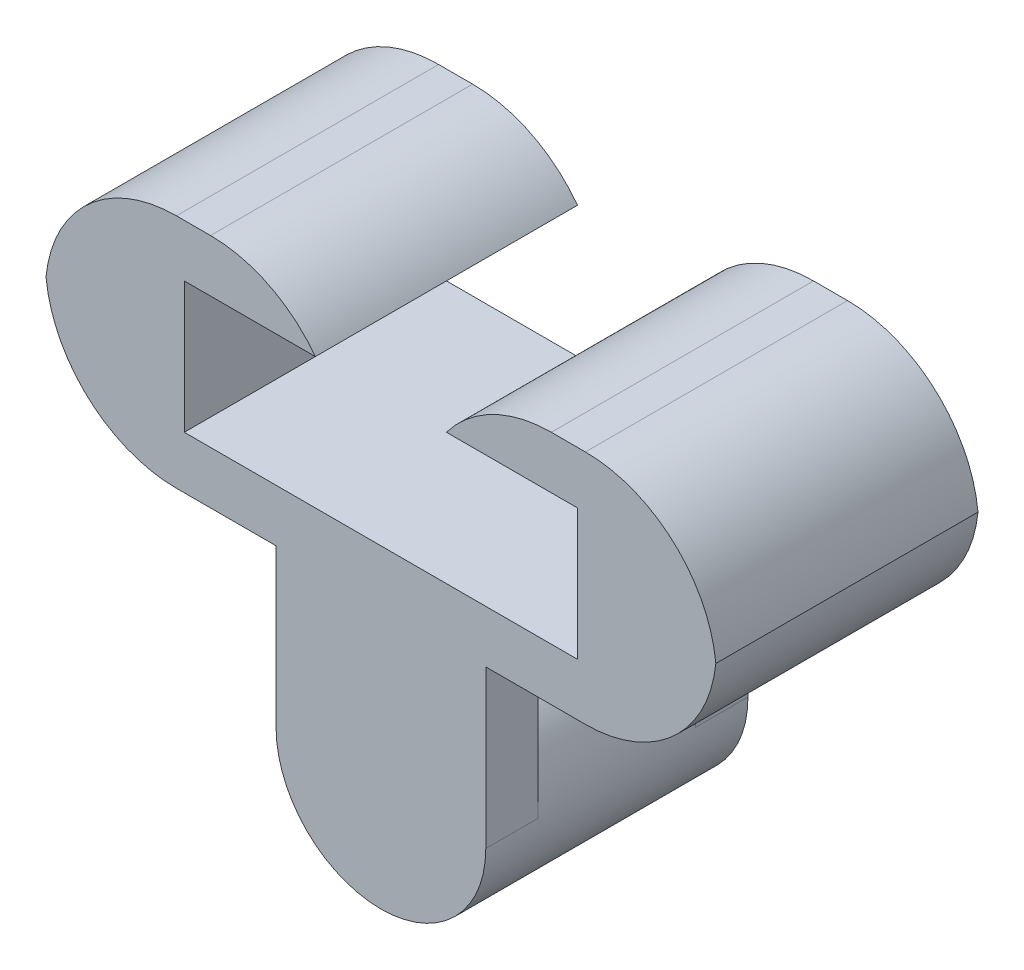
ISO-10303-21;
HEADER;
FILE_DESCRIPTION(('STEP AP214'),'2;1');
FILE_NAME('part.step','',(''),(''),'','','');
FILE_SCHEMA(('AUTOMOTIVE_DESIGN { 1 0 10303 214 1 1 1 1 }'));
ENDSEC;
DATA;
#1=APPLICATION_CONTEXT('core data for automotive mechanical design processes');
#2=APPLICATION_PROTOCOL_DEFINITION('international standard','automotive_design',2000,#1);
#3=PRODUCT_CONTEXT('',#1,'mechanical');
#4=PRODUCT('Part','Part','',(#3));
#5=PRODUCT_RELATED_PRODUCT_CATEGORY('part','',(#4));
#6=PRODUCT_DEFINITION_FORMATION('','',#4);
#7=PRODUCT_DEFINITION_CONTEXT('part definition',#1,'design');
#8=PRODUCT_DEFINITION('design','',#6,#7);
#9=PRODUCT_DEFINITION_SHAPE('','',#8);
#10=(LENGTH_UNIT() NAMED_UNIT(*) SI_UNIT(.MILLI.,.METRE.));
#11=(NAMED_UNIT(*) PLANE_ANGLE_UNIT() SI_UNIT($,.RADIAN.));
#12=(NAMED_UNIT(*) SI_UNIT($,.STERADIAN.) SOLID_ANGLE_UNIT());
#13=UNCERTAINTY_MEASURE_WITH_UNIT(LENGTH_MEASURE(1.E-05),#10,'distance_accuracy_value','');
#14=(GEOMETRIC_REPRESENTATION_CONTEXT(3) GLOBAL_UNCERTAINTY_ASSIGNED_CONTEXT((#13)) GLOBAL_UNIT_ASSIGNED_CONTEXT((#10,
#11,#12)) REPRESENTATION_CONTEXT('',''));
#15=CARTESIAN_POINT('',(0.,0.,0.));
#16=DIRECTION('',(0.,0.,1.));
#17=DIRECTION('',(1.,0.,0.));
#18=AXIS2_PLACEMENT_3D('',#15,#16,#17);
#19=CARTESIAN_POINT('',(65.024,-22.86,25.4));
#20=DIRECTION('',(0.,-1.,0.));
#21=DIRECTION('',(1.,0.,0.));
#22=AXIS2_PLACEMENT_3D('',#19,#20,#21);
#23=PLANE('',#22);
#24=DIRECTION('',(0.,0.,-1.));
#25=VECTOR('',#24,1.);
#26=CARTESIAN_POINT('',(22.352,-22.86,7.62));
#27=LINE('',#26,#25);
#28=CARTESIAN_POINT('',(22.352,-22.86,5.08));
#29=VERTEX_POINT('',#28);
#30=CARTESIAN_POINT('',(22.352,-22.86,0.));
#31=VERTEX_POINT('',#30);
#32=EDGE_CURVE('E374',#29,#31,#27,.T.);
#33=ORIENTED_EDGE('',*,*,#32,.F.);
#34=DIRECTION('',(0.707106781186548,0.,0.707106781186547));
#35=VECTOR('',#34,1.);
#36=CARTESIAN_POINT('',(22.352,-22.86,5.08));
#37=LINE('',#36,#35);
#38=CARTESIAN_POINT('',(24.892,-22.86,7.62));
#39=VERTEX_POINT('',#38);
#40=EDGE_CURVE('E417',#29,#39,#37,.T.);
#41=ORIENTED_EDGE('',*,*,#40,.T.);
#42=DIRECTION('',(1.,0.,0.));
#43=VECTOR('',#42,1.);
#44=CARTESIAN_POINT('',(22.352,-22.86,7.62));
#45=LINE('',#44,#43);
#46=CARTESIAN_POINT('',(40.132,-22.86,7.62));
#47=VERTEX_POINT('',#46);
#48=EDGE_CURVE('E231',#39,#47,#45,.T.);
#49=ORIENTED_EDGE('',*,*,#48,.T.);
#50=DIRECTION('',(0.707106781186549,0.,-0.707106781186546));
#51=VECTOR('',#50,1.);
#52=CARTESIAN_POINT('',(42.672,-22.86,5.08));
#53=LINE('',#52,#51);
#54=CARTESIAN_POINT('',(42.672,-22.86,5.08));
#55=VERTEX_POINT('',#54);
#56=EDGE_CURVE('E12',#47,#55,#53,.T.);
#57=ORIENTED_EDGE('',*,*,#56,.T.);
#58=DIRECTION('',(0.,0.,-1.));
#59=VECTOR('',#58,1.);
#60=CARTESIAN_POINT('',(42.672,-22.86,7.62));
#61=LINE('',#60,#59);
#62=CARTESIAN_POINT('',(42.672,-22.86,0.));
#63=VERTEX_POINT('',#62);
#64=EDGE_CURVE('E222',#55,#63,#61,.T.);
#65=ORIENTED_EDGE('',*,*,#64,.T.);
#66=DIRECTION('',(-1.,0.,0.));
#67=VECTOR('',#66,1.);
#68=CARTESIAN_POINT('',(65.024,-22.86,0.));
#69=LINE('',#68,#67);
#70=CARTESIAN_POINT('',(52.324,-22.86,0.));
#71=VERTEX_POINT('',#70);
#72=EDGE_CURVE('E226',#71,#63,#69,.T.);
#73=ORIENTED_EDGE('',*,*,#72,.F.);
#74=DIRECTION('',(0.,0.,-1.));
#75=VECTOR('',#74,1.);
#76=CARTESIAN_POINT('',(52.324,-22.86,25.4));
#77=LINE('',#76,#75);
#78=CARTESIAN_POINT('',(52.324,-22.86,25.4));
#79=VERTEX_POINT('',#78);
#80=EDGE_CURVE('E331',#71,#79,#77,.F.);
#81=ORIENTED_EDGE('',*,*,#80,.T.);
#82=DIRECTION('',(-1.,0.,0.));
#83=VECTOR('',#82,1.);
#84=CARTESIAN_POINT('',(65.024,-22.86,25.4));
#85=LINE('',#84,#83);
#86=CARTESIAN_POINT('',(42.672,-22.86,25.4));
#87=VERTEX_POINT('',#86);
#88=EDGE_CURVE('E528',#79,#87,#85,.T.);
#89=ORIENTED_EDGE('',*,*,#88,.T.);
#90=DIRECTION('',(0.,0.,1.));
#91=VECTOR('',#90,1.);
#92=CARTESIAN_POINT('',(42.672,-22.86,17.78));
#93=LINE('',#92,#91);
#94=CARTESIAN_POINT('',(42.672,-22.86,20.32));
#95=VERTEX_POINT('',#94);
#96=EDGE_CURVE('E256',#95,#87,#93,.T.);
#97=ORIENTED_EDGE('',*,*,#96,.F.);
#98=DIRECTION('',(-0.707106781186549,0.,-0.707106781186546));
#99=VECTOR('',#98,1.);
#100=CARTESIAN_POINT('',(42.672,-22.86,20.32));
#101=LINE('',#100,#99);
#102=CARTESIAN_POINT('',(40.132,-22.86,17.78));
#103=VERTEX_POINT('',#102);
#104=EDGE_CURVE('E388',#95,#103,#101,.T.);
#105=ORIENTED_EDGE('',*,*,#104,.T.);
#106=DIRECTION('',(-1.,0.,0.));
#107=VECTOR('',#106,1.);
#108=CARTESIAN_POINT('',(42.672,-22.86,17.78));
#109=LINE('',#108,#107);
#110=CARTESIAN_POINT('',(24.892,-22.86,17.78));
#111=VERTEX_POINT('',#110);
#112=EDGE_CURVE('E512',#103,#111,#109,.T.);
#113=ORIENTED_EDGE('',*,*,#112,.T.);
#114=DIRECTION('',(-0.707106781186549,0.,0.707106781186546));
#115=VECTOR('',#114,1.);
#116=CARTESIAN_POINT('',(22.352,-22.86,20.32));
#117=LINE('',#116,#115);
#118=CARTESIAN_POINT('',(22.352,-22.86,20.32));
#119=VERTEX_POINT('',#118);
#120=EDGE_CURVE('E397',#111,#119,#117,.T.);
#121=ORIENTED_EDGE('',*,*,#120,.T.);
#122=DIRECTION('',(0.,0.,1.));
#123=VECTOR('',#122,1.);
#124=CARTESIAN_POINT('',(22.352,-22.86,17.78));
#125=LINE('',#124,#123);
#126=CARTESIAN_POINT('',(22.352,-22.86,25.4));
#127=VERTEX_POINT('',#126);
#128=EDGE_CURVE('E507',#119,#127,#125,.T.);
#129=ORIENTED_EDGE('',*,*,#128,.T.);
#130=CARTESIAN_POINT('',(12.7,-22.86,25.4));
#131=VERTEX_POINT('',#130);
#132=EDGE_CURVE('E284',#127,#131,#85,.T.);
#133=ORIENTED_EDGE('',*,*,#132,.T.);
#134=DIRECTION('',(0.,0.,-1.));
#135=VECTOR('',#134,1.);
#136=CARTESIAN_POINT('',(12.7,-22.86,25.4));
#137=LINE('',#136,#135);
#138=CARTESIAN_POINT('',(12.7,-22.86,0.));
#139=VERTEX_POINT('',#138);
#140=EDGE_CURVE('E330',#131,#139,#137,.T.);
#141=ORIENTED_EDGE('',*,*,#140,.T.);
#142=EDGE_CURVE('E249',#31,#139,#69,.T.);
#143=ORIENTED_EDGE('',*,*,#142,.F.);
#144=EDGE_LOOP('',(#33,#41,#49,#57,#65,#73,#81,#89,#97,#105,#113,#121,#129,#133,#141,#143));
#145=FACE_BOUND('',#144,.T.);
#146=ADVANCED_FACE('F51',(#145),#23,.T.);
#147=CARTESIAN_POINT('',(38.862,0.,25.4));
#148=DIRECTION('',(0.,1.,0.));
#149=DIRECTION('',(0.,0.,1.));
#150=AXIS2_PLACEMENT_3D('',#147,#148,#149);
#151=PLANE('',#150);
#152=DIRECTION('',(1.,0.,0.));
#153=VECTOR('',#152,1.);
#154=CARTESIAN_POINT('',(38.862,0.,0.));
#155=LINE('',#154,#153);
#156=CARTESIAN_POINT('',(49.022,0.,0.));
#157=VERTEX_POINT('',#156);
#158=CARTESIAN_POINT('',(52.324,0.,0.));
#159=VERTEX_POINT('',#158);
#160=EDGE_CURVE('E281',#157,#159,#155,.T.);
#161=ORIENTED_EDGE('',*,*,#160,.F.);
#162=DIRECTION('',(0.,0.,-1.));
#163=VECTOR('',#162,1.);
#164=CARTESIAN_POINT('',(49.022,0.,25.4));
#165=LINE('',#164,#163);
#166=CARTESIAN_POINT('',(49.022,0.,25.4));
#167=VERTEX_POINT('',#166);
#168=EDGE_CURVE('E365',#157,#167,#165,.F.);
#169=ORIENTED_EDGE('',*,*,#168,.T.);
#170=DIRECTION('',(1.,0.,0.));
#171=VECTOR('',#170,1.);
#172=CARTESIAN_POINT('',(38.862,0.,25.4));
#173=LINE('',#172,#171);
#174=CARTESIAN_POINT('',(52.324,0.,25.4));
#175=VERTEX_POINT('',#174);
#176=EDGE_CURVE('E258',#167,#175,#173,.T.);
#177=ORIENTED_EDGE('',*,*,#176,.T.);
#178=DIRECTION('',(0.,0.,-1.));
#179=VECTOR('',#178,1.);
#180=CARTESIAN_POINT('',(52.324,0.,25.4));
#181=LINE('',#180,#179);
#182=EDGE_CURVE('E360',#175,#159,#181,.T.);
#183=ORIENTED_EDGE('',*,*,#182,.T.);
#184=EDGE_LOOP('',(#161,#169,#177,#183));
#185=FACE_BOUND('',#184,.T.);
#186=ADVANCED_FACE('F439',(#185),#151,.T.);
#187=CARTESIAN_POINT('',(51.562,-5.08,25.4));
#188=DIRECTION('',(0.,-1.,0.));
#189=DIRECTION('',(1.,0.,0.));
#190=AXIS2_PLACEMENT_3D('',#187,#188,#189);
#191=PLANE('',#190);
#192=DIRECTION('',(-1.,0.,0.));
#193=VECTOR('',#192,1.);
#194=CARTESIAN_POINT('',(51.562,-5.08,0.));
#195=LINE('',#194,#193);
#196=CARTESIAN_POINT('',(51.562,-5.08,0.));
#197=VERTEX_POINT('',#196);
#198=CARTESIAN_POINT('',(38.862,-5.08,0.));
#199=VERTEX_POINT('',#198);
#200=EDGE_CURVE('E276',#197,#199,#195,.T.);
#201=ORIENTED_EDGE('',*,*,#200,.F.);
#202=DIRECTION('',(0.,0.,-1.));
#203=VECTOR('',#202,1.);
#204=CARTESIAN_POINT('',(51.562,-5.08,25.4));
#205=LINE('',#204,#203);
#206=CARTESIAN_POINT('',(51.562,-5.08,25.4));
#207=VERTEX_POINT('',#206);
#208=EDGE_CURVE('E293',#207,#197,#205,.T.);
#209=ORIENTED_EDGE('',*,*,#208,.F.);
#210=DIRECTION('',(-1.,0.,0.));
#211=VECTOR('',#210,1.);
#212=CARTESIAN_POINT('',(51.562,-5.08,25.4));
#213=LINE('',#212,#211);
#214=CARTESIAN_POINT('',(38.862,-5.08,25.4));
#215=VERTEX_POINT('',#214);
#216=EDGE_CURVE('E552',#207,#215,#213,.T.);
#217=ORIENTED_EDGE('',*,*,#216,.T.);
#218=DIRECTION('',(0.,0.,-1.));
#219=VECTOR('',#218,1.);
#220=CARTESIAN_POINT('',(38.862,-5.08,25.4));
#221=LINE('',#220,#219);
#222=EDGE_CURVE('E286',#215,#199,#221,.T.);
#223=ORIENTED_EDGE('',*,*,#222,.T.);
#224=EDGE_LOOP('',(#201,#209,#217,#223));
#225=FACE_BOUND('',#224,.T.);
#226=ADVANCED_FACE('F450',(#225),#191,.T.);
#227=CARTESIAN_POINT('',(51.562,-17.78,25.4));
#228=DIRECTION('',(-1.,0.,0.));
#229=DIRECTION('',(0.,0.,1.));
#230=AXIS2_PLACEMENT_3D('',#227,#228,#229);
#231=PLANE('',#230);
#232=DIRECTION('',(0.,1.,0.));
#233=VECTOR('',#232,1.);
#234=CARTESIAN_POINT('',(51.562,-17.78,0.));
#235=LINE('',#234,#233);
#236=CARTESIAN_POINT('',(51.562,-17.78,0.));
#237=VERTEX_POINT('',#236);
#238=EDGE_CURVE('E271',#237,#197,#235,.T.);
#239=ORIENTED_EDGE('',*,*,#238,.F.);
#240=DIRECTION('',(0.,0.,-1.));
#241=VECTOR('',#240,1.);
#242=CARTESIAN_POINT('',(51.562,-17.78,25.4));
#243=LINE('',#242,#241);
#244=CARTESIAN_POINT('',(51.562,-17.78,25.4));
#245=VERTEX_POINT('',#244);
#246=EDGE_CURVE('E295',#245,#237,#243,.T.);
#247=ORIENTED_EDGE('',*,*,#246,.F.);
#248=DIRECTION('',(0.,1.,0.));
#249=VECTOR('',#248,1.);
#250=CARTESIAN_POINT('',(51.562,-17.78,25.4));
#251=LINE('',#250,#249);
#252=EDGE_CURVE('E548',#245,#207,#251,.T.);
#253=ORIENTED_EDGE('',*,*,#252,.T.);
#254=ORIENTED_EDGE('',*,*,#208,.T.);
#255=EDGE_LOOP('',(#239,#247,#253,#254));
#256=FACE_BOUND('',#255,.T.);
#257=ADVANCED_FACE('F573',(#256),#231,.T.);
#258=CARTESIAN_POINT('',(13.462,-17.78,25.4));
#259=DIRECTION('',(0.,1.,0.));
#260=DIRECTION('',(-1.,0.,0.));
#261=AXIS2_PLACEMENT_3D('',#258,#259,#260);
#262=PLANE('',#261);
#263=DIRECTION('',(1.,0.,0.));
#264=VECTOR('',#263,1.);
#265=CARTESIAN_POINT('',(13.462,-17.78,0.));
#266=LINE('',#265,#264);
#267=CARTESIAN_POINT('',(13.462,-17.78,0.));
#268=VERTEX_POINT('',#267);
#269=EDGE_CURVE('E268',#268,#237,#266,.T.);
#270=ORIENTED_EDGE('',*,*,#269,.F.);
#271=DIRECTION('',(0.,0.,-1.));
#272=VECTOR('',#271,1.);
#273=CARTESIAN_POINT('',(13.462,-17.78,25.4));
#274=LINE('',#273,#272);
#275=CARTESIAN_POINT('',(13.462,-17.78,25.4));
#276=VERTEX_POINT('',#275);
#277=EDGE_CURVE('E300',#276,#268,#274,.T.);
#278=ORIENTED_EDGE('',*,*,#277,.F.);
#279=DIRECTION('',(1.,0.,0.));
#280=VECTOR('',#279,1.);
#281=CARTESIAN_POINT('',(13.462,-17.78,25.4));
#282=LINE('',#281,#280);
#283=EDGE_CURVE('E544',#276,#245,#282,.T.);
#284=ORIENTED_EDGE('',*,*,#283,.T.);
#285=ORIENTED_EDGE('',*,*,#246,.T.);
#286=EDGE_LOOP('',(#270,#278,#284,#285));
#287=FACE_BOUND('',#286,.T.);
#288=ADVANCED_FACE('F579',(#287),#262,.T.);
#289=CARTESIAN_POINT('',(13.462,-5.08,25.4));
#290=DIRECTION('',(1.,0.,0.));
#291=DIRECTION('',(0.,1.,0.));
#292=AXIS2_PLACEMENT_3D('',#289,#290,#291);
#293=PLANE('',#292);
#294=DIRECTION('',(0.,-1.,0.));
#295=VECTOR('',#294,1.);
#296=CARTESIAN_POINT('',(13.462,-5.08,0.));
#297=LINE('',#296,#295);
#298=CARTESIAN_POINT('',(13.462,-5.08,0.));
#299=VERTEX_POINT('',#298);
#300=EDGE_CURVE('E264',#299,#268,#297,.T.);
#301=ORIENTED_EDGE('',*,*,#300,.F.);
#302=DIRECTION('',(0.,0.,-1.));
#303=VECTOR('',#302,1.);
#304=CARTESIAN_POINT('',(13.462,-5.08,25.4));
#305=LINE('',#304,#303);
#306=CARTESIAN_POINT('',(13.462,-5.08,25.4));
#307=VERTEX_POINT('',#306);
#308=EDGE_CURVE('E297',#307,#299,#305,.T.);
#309=ORIENTED_EDGE('',*,*,#308,.F.);
#310=DIRECTION('',(0.,-1.,0.));
#311=VECTOR('',#310,1.);
#312=CARTESIAN_POINT('',(13.462,-5.08,25.4));
#313=LINE('',#312,#311);
#314=EDGE_CURVE('E541',#307,#276,#313,.T.);
#315=ORIENTED_EDGE('',*,*,#314,.T.);
#316=ORIENTED_EDGE('',*,*,#277,.T.);
#317=EDGE_LOOP('',(#301,#309,#315,#316));
#318=FACE_BOUND('',#317,.T.);
#319=ADVANCED_FACE('F585',(#318),#293,.T.);
#320=CARTESIAN_POINT('',(26.162,-5.08,25.4));
#321=DIRECTION('',(0.,-1.,0.));
#322=DIRECTION('',(1.,0.,0.));
#323=AXIS2_PLACEMENT_3D('',#320,#321,#322);
#324=PLANE('',#323);
#325=DIRECTION('',(-1.,0.,0.));
#326=VECTOR('',#325,1.);
#327=CARTESIAN_POINT('',(26.162,-5.08,0.));
#328=LINE('',#327,#326);
#329=CARTESIAN_POINT('',(26.162,-5.08,0.));
#330=VERTEX_POINT('',#329);
#331=EDGE_CURVE('E253',#330,#299,#328,.T.);
#332=ORIENTED_EDGE('',*,*,#331,.F.);
#333=DIRECTION('',(0.,0.,-1.));
#334=VECTOR('',#333,1.);
#335=CARTESIAN_POINT('',(26.162,-5.08,25.4));
#336=LINE('',#335,#334);
#337=CARTESIAN_POINT('',(26.162,-5.08,25.4));
#338=VERTEX_POINT('',#337);
#339=EDGE_CURVE('E303',#338,#330,#336,.T.);
#340=ORIENTED_EDGE('',*,*,#339,.F.);
#341=DIRECTION('',(-1.,0.,0.));
#342=VECTOR('',#341,1.);
#343=CARTESIAN_POINT('',(26.162,-5.08,25.4));
#344=LINE('',#343,#342);
#345=EDGE_CURVE('E536',#338,#307,#344,.T.);
#346=ORIENTED_EDGE('',*,*,#345,.T.);
#347=ORIENTED_EDGE('',*,*,#308,.T.);
#348=EDGE_LOOP('',(#332,#340,#346,#347));
#349=FACE_BOUND('',#348,.T.);
#350=ADVANCED_FACE('F586',(#349),#324,.T.);
#351=CARTESIAN_POINT('',(0.,0.,25.4));
#352=DIRECTION('',(0.,1.,0.));
#353=DIRECTION('',(0.,0.,1.));
#354=AXIS2_PLACEMENT_3D('',#351,#352,#353);
#355=PLANE('',#354);
#356=DIRECTION('',(1.,0.,0.));
#357=VECTOR('',#356,1.);
#358=CARTESIAN_POINT('',(0.,0.,0.));
#359=LINE('',#358,#357);
#360=CARTESIAN_POINT('',(12.7,0.,0.));
#361=VERTEX_POINT('',#360);
#362=CARTESIAN_POINT('',(16.002,0.,0.));
#363=VERTEX_POINT('',#362);
#364=EDGE_CURVE('E248',#361,#363,#359,.T.);
#365=ORIENTED_EDGE('',*,*,#364,.F.);
#366=DIRECTION('',(0.,0.,-1.));
#367=VECTOR('',#366,1.);
#368=CARTESIAN_POINT('',(12.7,0.,25.4));
#369=LINE('',#368,#367);
#370=CARTESIAN_POINT('',(12.7,0.,25.4));
#371=VERTEX_POINT('',#370);
#372=EDGE_CURVE('E358',#361,#371,#369,.F.);
#373=ORIENTED_EDGE('',*,*,#372,.T.);
#374=DIRECTION('',(1.,0.,0.));
#375=VECTOR('',#374,1.);
#376=CARTESIAN_POINT('',(0.,0.,25.4));
#377=LINE('',#376,#375);
#378=CARTESIAN_POINT('',(16.002,0.,25.4));
#379=VERTEX_POINT('',#378);
#380=EDGE_CURVE('E531',#371,#379,#377,.T.);
#381=ORIENTED_EDGE('',*,*,#380,.T.);
#382=DIRECTION('',(0.,0.,1.));
#383=VECTOR('',#382,1.);
#384=CARTESIAN_POINT('',(16.002,0.,0.));
#385=LINE('',#384,#383);
#386=EDGE_CURVE('E355',#379,#363,#385,.F.);
#387=ORIENTED_EDGE('',*,*,#386,.T.);
#388=EDGE_LOOP('',(#365,#373,#381,#387));
#389=FACE_BOUND('',#388,.T.);
#390=ADVANCED_FACE('F451',(#389),#355,.T.);
#391=CARTESIAN_POINT('',(0.,0.,25.4));
#392=DIRECTION('',(0.,0.,-1.));
#393=DIRECTION('',(-1.,0.,0.));
#394=AXIS2_PLACEMENT_3D('',#391,#392,#393);
#395=PLANE('',#394);
#396=CARTESIAN_POINT('',(12.7,-12.7,25.4));
#397=DIRECTION('',(0.,0.,-1.));
#398=DIRECTION('',(-1.,0.,0.));
#399=AXIS2_PLACEMENT_3D('',#396,#397,#398);
#400=CIRCLE('',#399,12.7);
#401=CARTESIAN_POINT('',(0.0636595487459278,-11.43,25.4));
#402=VERTEX_POINT('',#401);
#403=EDGE_CURVE('E346',#371,#402,#400,.F.);
#404=ORIENTED_EDGE('',*,*,#403,.T.);
#405=CARTESIAN_POINT('',(12.7,-10.16,25.4));
#406=DIRECTION('',(0.,0.,-1.));
#407=DIRECTION('',(-1.,0.,0.));
#408=AXIS2_PLACEMENT_3D('',#405,#406,#407);
#409=CIRCLE('',#408,12.7);
#410=EDGE_CURVE('E347',#402,#131,#409,.F.);
#411=ORIENTED_EDGE('',*,*,#410,.T.);
#412=ORIENTED_EDGE('',*,*,#132,.F.);
#413=DIRECTION('',(0.,-1.,0.));
#414=VECTOR('',#413,1.);
#415=CARTESIAN_POINT('',(22.352,-22.86,25.4));
#416=LINE('',#415,#414);
#417=CARTESIAN_POINT('',(22.352,-38.1,25.4));
#418=VERTEX_POINT('',#417);
#419=EDGE_CURVE('E519',#127,#418,#416,.T.);
#420=ORIENTED_EDGE('',*,*,#419,.T.);
#421=CARTESIAN_POINT('',(32.512,-38.1,25.4));
#422=DIRECTION('',(0.,0.,1.));
#423=DIRECTION('',(1.,0.,0.));
#424=AXIS2_PLACEMENT_3D('',#421,#422,#423);
#425=CIRCLE('',#424,10.16);
#426=CARTESIAN_POINT('',(42.672,-38.1,25.4));
#427=VERTEX_POINT('',#426);
#428=EDGE_CURVE('E369',#418,#427,#425,.T.);
#429=ORIENTED_EDGE('',*,*,#428,.T.);
#430=DIRECTION('',(0.,1.,0.));
#431=VECTOR('',#430,1.);
#432=CARTESIAN_POINT('',(42.672,-38.1,25.4));
#433=LINE('',#432,#431);
#434=EDGE_CURVE('E524',#427,#87,#433,.T.);
#435=ORIENTED_EDGE('',*,*,#434,.T.);
#436=ORIENTED_EDGE('',*,*,#88,.F.);
#437=CARTESIAN_POINT('',(52.324,-10.16,25.4));
#438=DIRECTION('',(0.,0.,-1.));
#439=DIRECTION('',(-1.,0.,0.));
#440=AXIS2_PLACEMENT_3D('',#437,#438,#439);
#441=CIRCLE('',#440,12.7);
#442=CARTESIAN_POINT('',(64.9603404512541,-11.43,25.4));
#443=VERTEX_POINT('',#442);
#444=EDGE_CURVE('E340',#79,#443,#441,.F.);
#445=ORIENTED_EDGE('',*,*,#444,.T.);
#446=CARTESIAN_POINT('',(52.324,-12.7,25.4));
#447=DIRECTION('',(0.,0.,-1.));
#448=DIRECTION('',(-1.,0.,0.));
#449=AXIS2_PLACEMENT_3D('',#446,#447,#448);
#450=CIRCLE('',#449,12.7);
#451=EDGE_CURVE('E333',#443,#175,#450,.F.);
#452=ORIENTED_EDGE('',*,*,#451,.T.);
#453=ORIENTED_EDGE('',*,*,#176,.F.);
#454=CARTESIAN_POINT('',(49.022,-12.7,25.4));
#455=DIRECTION('',(0.,0.,-1.));
#456=DIRECTION('',(-1.,0.,0.));
#457=AXIS2_PLACEMENT_3D('',#454,#455,#456);
#458=CIRCLE('',#457,12.7);
#459=EDGE_CURVE('E338',#167,#215,#458,.F.);
#460=ORIENTED_EDGE('',*,*,#459,.T.);
#461=ORIENTED_EDGE('',*,*,#216,.F.);
#462=ORIENTED_EDGE('',*,*,#252,.F.);
#463=ORIENTED_EDGE('',*,*,#283,.F.);
#464=ORIENTED_EDGE('',*,*,#314,.F.);
#465=ORIENTED_EDGE('',*,*,#345,.F.);
#466=CARTESIAN_POINT('',(16.002,-12.7,25.4));
#467=DIRECTION('',(0.,0.,-1.));
#468=DIRECTION('',(-1.,0.,0.));
#469=AXIS2_PLACEMENT_3D('',#466,#467,#468);
#470=CIRCLE('',#469,12.7);
#471=EDGE_CURVE('E345',#338,#379,#470,.F.);
#472=ORIENTED_EDGE('',*,*,#471,.T.);
#473=ORIENTED_EDGE('',*,*,#380,.F.);
#474=EDGE_LOOP('',(#404,#411,#412,#420,#429,#435,#436,#445,#452,#453,#460,#461,#462,#463,#464,
#465,#472,#473));
#475=FACE_BOUND('',#474,.T.);
#476=ADVANCED_FACE('F567',(#475),#395,.F.);
#477=CARTESIAN_POINT('',(0.,0.,0.));
#478=DIRECTION('',(0.,0.,-1.));
#479=DIRECTION('',(-1.,0.,0.));
#480=AXIS2_PLACEMENT_3D('',#477,#478,#479);
#481=PLANE('',#480);
#482=ORIENTED_EDGE('',*,*,#72,.T.);
#483=DIRECTION('',(0.,-1.,0.));
#484=VECTOR('',#483,1.);
#485=CARTESIAN_POINT('',(42.672,-22.86,0.));
#486=LINE('',#485,#484);
#487=CARTESIAN_POINT('',(42.672,-38.1,0.));
#488=VERTEX_POINT('',#487);
#489=EDGE_CURVE('E236',#63,#488,#486,.T.);
#490=ORIENTED_EDGE('',*,*,#489,.T.);
#491=CARTESIAN_POINT('',(32.512,-38.1,0.));
#492=DIRECTION('',(0.,0.,1.));
#493=DIRECTION('',(1.,0.,0.));
#494=AXIS2_PLACEMENT_3D('',#491,#492,#493);
#495=CIRCLE('',#494,10.16);
#496=CARTESIAN_POINT('',(22.352,-38.1,0.));
#497=VERTEX_POINT('',#496);
#498=EDGE_CURVE('E605',#497,#488,#495,.T.);
#499=ORIENTED_EDGE('',*,*,#498,.F.);
#500=DIRECTION('',(0.,1.,0.));
#501=VECTOR('',#500,1.);
#502=CARTESIAN_POINT('',(22.352,-38.1,0.));
#503=LINE('',#502,#501);
#504=EDGE_CURVE('E243',#497,#31,#503,.T.);
#505=ORIENTED_EDGE('',*,*,#504,.T.);
#506=ORIENTED_EDGE('',*,*,#142,.T.);
#507=CARTESIAN_POINT('',(12.7,-10.16,0.));
#508=DIRECTION('',(0.,0.,-1.));
#509=DIRECTION('',(-1.,0.,0.));
#510=AXIS2_PLACEMENT_3D('',#507,#508,#509);
#511=CIRCLE('',#510,12.7);
#512=CARTESIAN_POINT('',(0.0636595487459278,-11.43,0.));
#513=VERTEX_POINT('',#512);
#514=EDGE_CURVE('E323',#139,#513,#511,.T.);
#515=ORIENTED_EDGE('',*,*,#514,.T.);
#516=CARTESIAN_POINT('',(12.7,-12.7,0.));
#517=DIRECTION('',(0.,0.,-1.));
#518=DIRECTION('',(-1.,0.,0.));
#519=AXIS2_PLACEMENT_3D('',#516,#517,#518);
#520=CIRCLE('',#519,12.7);
#521=EDGE_CURVE('E324',#513,#361,#520,.T.);
#522=ORIENTED_EDGE('',*,*,#521,.T.);
#523=ORIENTED_EDGE('',*,*,#364,.T.);
#524=CARTESIAN_POINT('',(16.002,-12.7,0.));
#525=DIRECTION('',(0.,0.,-1.));
#526=DIRECTION('',(-1.,0.,0.));
#527=AXIS2_PLACEMENT_3D('',#524,#525,#526);
#528=CIRCLE('',#527,12.7);
#529=EDGE_CURVE('E319',#363,#330,#528,.T.);
#530=ORIENTED_EDGE('',*,*,#529,.T.);
#531=ORIENTED_EDGE('',*,*,#331,.T.);
#532=ORIENTED_EDGE('',*,*,#300,.T.);
#533=ORIENTED_EDGE('',*,*,#269,.T.);
#534=ORIENTED_EDGE('',*,*,#238,.T.);
#535=ORIENTED_EDGE('',*,*,#200,.T.);
#536=CARTESIAN_POINT('',(49.022,-12.7,0.));
#537=DIRECTION('',(0.,0.,-1.));
#538=DIRECTION('',(-1.,0.,0.));
#539=AXIS2_PLACEMENT_3D('',#536,#537,#538);
#540=CIRCLE('',#539,12.7);
#541=EDGE_CURVE('E314',#199,#157,#540,.T.);
#542=ORIENTED_EDGE('',*,*,#541,.T.);
#543=ORIENTED_EDGE('',*,*,#160,.T.);
#544=CARTESIAN_POINT('',(52.324,-12.7,0.));
#545=DIRECTION('',(0.,0.,-1.));
#546=DIRECTION('',(-1.,0.,0.));
#547=AXIS2_PLACEMENT_3D('',#544,#545,#546);
#548=CIRCLE('',#547,12.7);
#549=CARTESIAN_POINT('',(64.9603404512541,-11.43,0.));
#550=VERTEX_POINT('',#549);
#551=EDGE_CURVE('E309',#159,#550,#548,.T.);
#552=ORIENTED_EDGE('',*,*,#551,.T.);
#553=CARTESIAN_POINT('',(52.324,-10.16,0.));
#554=DIRECTION('',(0.,0.,-1.));
#555=DIRECTION('',(-1.,0.,0.));
#556=AXIS2_PLACEMENT_3D('',#553,#554,#555);
#557=CIRCLE('',#556,12.7);
#558=EDGE_CURVE('E250',#550,#71,#557,.T.);
#559=ORIENTED_EDGE('',*,*,#558,.T.);
#560=EDGE_LOOP('',(#482,#490,#499,#505,#506,#515,#522,#523,#530,#531,#532,#533,#534,#535,#542,
#543,#552,#559));
#561=FACE_BOUND('',#560,.T.);
#562=ADVANCED_FACE('F244',(#561),#481,.T.);
#563=CARTESIAN_POINT('',(42.672,-38.1,17.78));
#564=DIRECTION('',(1.,0.,0.));
#565=DIRECTION('',(0.,1.,0.));
#566=AXIS2_PLACEMENT_3D('',#563,#564,#565);
#567=PLANE('',#566);
#568=DIRECTION('',(0.,0.,1.));
#569=VECTOR('',#568,1.);
#570=CARTESIAN_POINT('',(42.672,-38.1,17.78));
#571=LINE('',#570,#569);
#572=CARTESIAN_POINT('',(42.672,-38.1,20.32));
#573=VERTEX_POINT('',#572);
#574=EDGE_CURVE('E523',#573,#427,#571,.T.);
#575=ORIENTED_EDGE('',*,*,#574,.F.);
#576=DIRECTION('',(0.,1.,0.));
#577=VECTOR('',#576,1.);
#578=CARTESIAN_POINT('',(42.672,-22.86,20.32));
#579=LINE('',#578,#577);
#580=EDGE_CURVE('E362',#573,#95,#579,.T.);
#581=ORIENTED_EDGE('',*,*,#580,.T.);
#582=ORIENTED_EDGE('',*,*,#96,.T.);
#583=ORIENTED_EDGE('',*,*,#434,.F.);
#584=EDGE_LOOP('',(#575,#581,#582,#583));
#585=FACE_BOUND('',#584,.T.);
#586=ADVANCED_FACE('F640',(#585),#567,.T.);
#587=CARTESIAN_POINT('',(22.352,-22.86,17.78));
#588=DIRECTION('',(-1.,0.,0.));
#589=DIRECTION('',(0.,-1.,0.));
#590=AXIS2_PLACEMENT_3D('',#587,#588,#589);
#591=PLANE('',#590);
#592=ORIENTED_EDGE('',*,*,#128,.F.);
#593=DIRECTION('',(0.,-1.,0.));
#594=VECTOR('',#593,1.);
#595=CARTESIAN_POINT('',(22.352,-38.1,20.32));
#596=LINE('',#595,#594);
#597=CARTESIAN_POINT('',(22.352,-38.1,20.32));
#598=VERTEX_POINT('',#597);
#599=EDGE_CURVE('E383',#119,#598,#596,.T.);
#600=ORIENTED_EDGE('',*,*,#599,.T.);
#601=DIRECTION('',(0.,0.,1.));
#602=VECTOR('',#601,1.);
#603=CARTESIAN_POINT('',(22.352,-38.1,17.78));
#604=LINE('',#603,#602);
#605=EDGE_CURVE('E518',#598,#418,#604,.T.);
#606=ORIENTED_EDGE('',*,*,#605,.T.);
#607=ORIENTED_EDGE('',*,*,#419,.F.);
#608=EDGE_LOOP('',(#592,#600,#606,#607));
#609=FACE_BOUND('',#608,.T.);
#610=ADVANCED_FACE('F514',(#609),#591,.T.);
#611=CARTESIAN_POINT('',(0.,0.,17.78));
#612=DIRECTION('',(0.,0.,1.));
#613=DIRECTION('',(1.,0.,0.));
#614=AXIS2_PLACEMENT_3D('',#611,#612,#613);
#615=PLANE('',#614);
#616=ORIENTED_EDGE('',*,*,#112,.F.);
#617=DIRECTION('',(0.,-1.,0.));
#618=VECTOR('',#617,1.);
#619=CARTESIAN_POINT('',(40.132,-38.1,17.78));
#620=LINE('',#619,#618);
#621=CARTESIAN_POINT('',(40.132,-31.3797916698959,17.78));
#622=VERTEX_POINT('',#621);
#623=EDGE_CURVE('E385',#103,#622,#620,.T.);
#624=ORIENTED_EDGE('',*,*,#623,.T.);
#625=CARTESIAN_POINT('',(32.512,-38.1,17.78));
#626=DIRECTION('',(0.,0.,1.));
#627=DIRECTION('',(1.,0.,0.));
#628=AXIS2_PLACEMENT_3D('',#625,#626,#627);
#629=CIRCLE('',#628,10.16);
#630=CARTESIAN_POINT('',(24.892,-31.3797916698959,17.78));
#631=VERTEX_POINT('',#630);
#632=EDGE_CURVE('E289',#622,#631,#629,.T.);
#633=ORIENTED_EDGE('',*,*,#632,.T.);
#634=DIRECTION('',(0.,1.,0.));
#635=VECTOR('',#634,1.);
#636=CARTESIAN_POINT('',(24.892,-22.86,17.78));
#637=LINE('',#636,#635);
#638=EDGE_CURVE('E377',#631,#111,#637,.T.);
#639=ORIENTED_EDGE('',*,*,#638,.T.);
#640=EDGE_LOOP('',(#616,#624,#633,#639));
#641=FACE_BOUND('',#640,.T.);
#642=ADVANCED_FACE('F642',(#641),#615,.F.);
#643=CARTESIAN_POINT('',(32.512,-38.1,0.));
#644=DIRECTION('',(0.,0.,1.));
#645=DIRECTION('',(1.,0.,0.));
#646=AXIS2_PLACEMENT_3D('',#643,#644,#645);
#647=CYLINDRICAL_SURFACE('',#646,10.16);
#648=CARTESIAN_POINT('',(32.512,-38.1,7.62));
#649=DIRECTION('',(0.,0.,-1.));
#650=DIRECTION('',(-1.,0.,0.));
#651=AXIS2_PLACEMENT_3D('',#648,#649,#650);
#652=CIRCLE('',#651,10.16);
#653=CARTESIAN_POINT('',(40.132,-31.3797916698959,7.62));
#654=VERTEX_POINT('',#653);
#655=CARTESIAN_POINT('',(24.892,-31.3797916698959,7.62));
#656=VERTEX_POINT('',#655);
#657=EDGE_CURVE('E402',#654,#656,#652,.F.);
#658=ORIENTED_EDGE('',*,*,#657,.T.);
#659=CARTESIAN_POINT('',(32.512,-38.1,15.24));
#660=DIRECTION('',(-0.707106781186547,0.,0.707106781186548));
#661=DIRECTION('',(0.707106781186548,0.,0.707106781186547));
#662=AXIS2_PLACEMENT_3D('',#659,#660,#661);
#663=ELLIPSE('',#662,14.3684097937106,10.16);
#664=CARTESIAN_POINT('',(22.352,-38.1,5.08));
#665=VERTEX_POINT('',#664);
#666=EDGE_CURVE('E423',#656,#665,#663,.T.);
#667=ORIENTED_EDGE('',*,*,#666,.T.);
#668=DIRECTION('',(0.,0.,-1.));
#669=VECTOR('',#668,1.);
#670=CARTESIAN_POINT('',(22.352,-38.1,7.62));
#671=LINE('',#670,#669);
#672=EDGE_CURVE('E615',#665,#497,#671,.T.);
#673=ORIENTED_EDGE('',*,*,#672,.T.);
#674=ORIENTED_EDGE('',*,*,#498,.T.);
#675=DIRECTION('',(0.,0.,-1.));
#676=VECTOR('',#675,1.);
#677=CARTESIAN_POINT('',(42.672,-38.1,7.62));
#678=LINE('',#677,#676);
#679=CARTESIAN_POINT('',(42.672,-38.1,5.08));
#680=VERTEX_POINT('',#679);
#681=EDGE_CURVE('E235',#680,#488,#678,.T.);
#682=ORIENTED_EDGE('',*,*,#681,.F.);
#683=CARTESIAN_POINT('',(32.512,-38.1,15.24));
#684=DIRECTION('',(0.707106781186546,0.,0.707106781186549));
#685=DIRECTION('',(-0.707106781186549,0.,0.707106781186546));
#686=AXIS2_PLACEMENT_3D('',#683,#684,#685);
#687=ELLIPSE('',#686,14.3684097937106,10.16);
#688=EDGE_CURVE('E64',#680,#654,#687,.T.);
#689=ORIENTED_EDGE('',*,*,#688,.T.);
#690=EDGE_LOOP('',(#658,#667,#673,#674,#682,#689));
#691=FACE_BOUND('',#690,.T.);
#692=ORIENTED_EDGE('',*,*,#632,.F.);
#693=CARTESIAN_POINT('',(32.512,-38.1,10.16));
#694=DIRECTION('',(0.707106781186546,0.,-0.707106781186549));
#695=DIRECTION('',(0.707106781186549,0.,0.707106781186546));
#696=AXIS2_PLACEMENT_3D('',#693,#694,#695);
#697=ELLIPSE('',#696,14.3684097937106,10.16);
#698=EDGE_CURVE('E395',#622,#573,#697,.T.);
#699=ORIENTED_EDGE('',*,*,#698,.T.);
#700=ORIENTED_EDGE('',*,*,#574,.T.);
#701=ORIENTED_EDGE('',*,*,#428,.F.);
#702=ORIENTED_EDGE('',*,*,#605,.F.);
#703=CARTESIAN_POINT('',(32.512,-38.1,10.1600000000001));
#704=DIRECTION('',(-0.707106781186546,0.,-0.707106781186549));
#705=DIRECTION('',(-0.707106781186549,0.,0.707106781186546));
#706=AXIS2_PLACEMENT_3D('',#703,#704,#705);
#707=ELLIPSE('',#706,14.3684097937106,10.16);
#708=EDGE_CURVE('E394',#598,#631,#707,.T.);
#709=ORIENTED_EDGE('',*,*,#708,.T.);
#710=EDGE_LOOP('',(#692,#699,#700,#701,#702,#709));
#711=FACE_BOUND('',#710,.T.);
#712=ADVANCED_FACE('F428',(#691,#711),#647,.T.);
#713=CARTESIAN_POINT('',(52.324,-12.7,25.4));
#714=DIRECTION('',(0.,0.,-1.));
#715=DIRECTION('',(-1.,0.,0.));
#716=AXIS2_PLACEMENT_3D('',#713,#714,#715);
#717=CYLINDRICAL_SURFACE('',#716,12.7);
#718=ORIENTED_EDGE('',*,*,#182,.F.);
#719=ORIENTED_EDGE('',*,*,#451,.F.);
#720=DIRECTION('',(0.,0.,-1.));
#721=VECTOR('',#720,1.);
#722=CARTESIAN_POINT('',(64.9603404512541,-11.43,12.7));
#723=LINE('',#722,#721);
#724=EDGE_CURVE('E366',#550,#443,#723,.F.);
#725=ORIENTED_EDGE('',*,*,#724,.F.);
#726=ORIENTED_EDGE('',*,*,#551,.F.);
#727=EDGE_LOOP('',(#718,#719,#725,#726));
#728=FACE_BOUND('',#727,.T.);
#729=ADVANCED_FACE('F458',(#728),#717,.T.);
#730=CARTESIAN_POINT('',(52.324,-10.16,25.4));
#731=DIRECTION('',(0.,0.,-1.));
#732=DIRECTION('',(-1.,0.,0.));
#733=AXIS2_PLACEMENT_3D('',#730,#731,#732);
#734=CYLINDRICAL_SURFACE('',#733,12.7);
#735=ORIENTED_EDGE('',*,*,#444,.F.);
#736=ORIENTED_EDGE('',*,*,#80,.F.);
#737=ORIENTED_EDGE('',*,*,#558,.F.);
#738=ORIENTED_EDGE('',*,*,#724,.T.);
#739=EDGE_LOOP('',(#735,#736,#737,#738));
#740=FACE_BOUND('',#739,.T.);
#741=ADVANCED_FACE('F453',(#740),#734,.T.);
#742=CARTESIAN_POINT('',(12.7,-12.7,25.4));
#743=DIRECTION('',(0.,0.,-1.));
#744=DIRECTION('',(-1.,0.,0.));
#745=AXIS2_PLACEMENT_3D('',#742,#743,#744);
#746=CYLINDRICAL_SURFACE('',#745,12.7);
#747=DIRECTION('',(0.,0.,-1.));
#748=VECTOR('',#747,1.);
#749=CARTESIAN_POINT('',(0.0636595487459278,-11.43,12.7));
#750=LINE('',#749,#748);
#751=EDGE_CURVE('E371',#402,#513,#750,.T.);
#752=ORIENTED_EDGE('',*,*,#751,.F.);
#753=ORIENTED_EDGE('',*,*,#403,.F.);
#754=ORIENTED_EDGE('',*,*,#372,.F.);
#755=ORIENTED_EDGE('',*,*,#521,.F.);
#756=EDGE_LOOP('',(#752,#753,#754,#755));
#757=FACE_BOUND('',#756,.T.);
#758=ADVANCED_FACE('F460',(#757),#746,.T.);
#759=CARTESIAN_POINT('',(12.7,-10.16,25.4));
#760=DIRECTION('',(0.,0.,-1.));
#761=DIRECTION('',(-1.,0.,0.));
#762=AXIS2_PLACEMENT_3D('',#759,#760,#761);
#763=CYLINDRICAL_SURFACE('',#762,12.7);
#764=ORIENTED_EDGE('',*,*,#410,.F.);
#765=ORIENTED_EDGE('',*,*,#751,.T.);
#766=ORIENTED_EDGE('',*,*,#514,.F.);
#767=ORIENTED_EDGE('',*,*,#140,.F.);
#768=EDGE_LOOP('',(#764,#765,#766,#767));
#769=FACE_BOUND('',#768,.T.);
#770=ADVANCED_FACE('F462',(#769),#763,.T.);
#771=CARTESIAN_POINT('',(16.002,-12.7,25.4));
#772=DIRECTION('',(0.,0.,-1.));
#773=DIRECTION('',(-1.,0.,0.));
#774=AXIS2_PLACEMENT_3D('',#771,#772,#773);
#775=CYLINDRICAL_SURFACE('',#774,12.7);
#776=ORIENTED_EDGE('',*,*,#471,.F.);
#777=ORIENTED_EDGE('',*,*,#339,.T.);
#778=ORIENTED_EDGE('',*,*,#529,.F.);
#779=ORIENTED_EDGE('',*,*,#386,.F.);
#780=EDGE_LOOP('',(#776,#777,#778,#779));
#781=FACE_BOUND('',#780,.T.);
#782=ADVANCED_FACE('F467',(#781),#775,.T.);
#783=CARTESIAN_POINT('',(49.022,-12.7,25.4));
#784=DIRECTION('',(0.,0.,1.));
#785=DIRECTION('',(1.,0.,0.));
#786=AXIS2_PLACEMENT_3D('',#783,#784,#785);
#787=CYLINDRICAL_SURFACE('',#786,12.7);
#788=ORIENTED_EDGE('',*,*,#459,.F.);
#789=ORIENTED_EDGE('',*,*,#168,.F.);
#790=ORIENTED_EDGE('',*,*,#541,.F.);
#791=ORIENTED_EDGE('',*,*,#222,.F.);
#792=EDGE_LOOP('',(#788,#789,#790,#791));
#793=FACE_BOUND('',#792,.T.);
#794=ADVANCED_FACE('F475',(#793),#787,.T.);
#795=CARTESIAN_POINT('',(42.672,-38.1,20.32));
#796=DIRECTION('',(0.707106781186546,0.,-0.707106781186549));
#797=DIRECTION('',(0.,-1.,0.));
#798=AXIS2_PLACEMENT_3D('',#795,#796,#797);
#799=PLANE('',#798);
#800=ORIENTED_EDGE('',*,*,#698,.F.);
#801=ORIENTED_EDGE('',*,*,#623,.F.);
#802=ORIENTED_EDGE('',*,*,#104,.F.);
#803=ORIENTED_EDGE('',*,*,#580,.F.);
#804=EDGE_LOOP('',(#800,#801,#802,#803));
#805=FACE_BOUND('',#804,.T.);
#806=ADVANCED_FACE('F480',(#805),#799,.T.);
#807=CARTESIAN_POINT('',(22.352,-22.86,20.32));
#808=DIRECTION('',(-0.707106781186546,0.,-0.707106781186549));
#809=DIRECTION('',(0.,1.,0.));
#810=AXIS2_PLACEMENT_3D('',#807,#808,#809);
#811=PLANE('',#810);
#812=ORIENTED_EDGE('',*,*,#120,.F.);
#813=ORIENTED_EDGE('',*,*,#638,.F.);
#814=ORIENTED_EDGE('',*,*,#708,.F.);
#815=ORIENTED_EDGE('',*,*,#599,.F.);
#816=EDGE_LOOP('',(#812,#813,#814,#815));
#817=FACE_BOUND('',#816,.T.);
#818=ADVANCED_FACE('F484',(#817),#811,.T.);
#819=CARTESIAN_POINT('',(22.352,-38.1,7.62));
#820=DIRECTION('',(-1.,0.,0.));
#821=DIRECTION('',(0.,0.,1.));
#822=AXIS2_PLACEMENT_3D('',#819,#820,#821);
#823=PLANE('',#822);
#824=ORIENTED_EDGE('',*,*,#672,.F.);
#825=DIRECTION('',(0.,1.,0.));
#826=VECTOR('',#825,1.);
#827=CARTESIAN_POINT('',(22.352,-22.86,5.08));
#828=LINE('',#827,#826);
#829=EDGE_CURVE('E403',#665,#29,#828,.T.);
#830=ORIENTED_EDGE('',*,*,#829,.T.);
#831=ORIENTED_EDGE('',*,*,#32,.T.);
#832=ORIENTED_EDGE('',*,*,#504,.F.);
#833=EDGE_LOOP('',(#824,#830,#831,#832));
#834=FACE_BOUND('',#833,.T.);
#835=ADVANCED_FACE('F493',(#834),#823,.T.);
#836=CARTESIAN_POINT('',(42.672,-22.86,7.62));
#837=DIRECTION('',(1.,0.,0.));
#838=DIRECTION('',(0.,1.,0.));
#839=AXIS2_PLACEMENT_3D('',#836,#837,#838);
#840=PLANE('',#839);
#841=ORIENTED_EDGE('',*,*,#64,.F.);
#842=DIRECTION('',(0.,-1.,0.));
#843=VECTOR('',#842,1.);
#844=CARTESIAN_POINT('',(42.672,-38.1,5.08));
#845=LINE('',#844,#843);
#846=EDGE_CURVE('E414',#55,#680,#845,.T.);
#847=ORIENTED_EDGE('',*,*,#846,.T.);
#848=ORIENTED_EDGE('',*,*,#681,.T.);
#849=ORIENTED_EDGE('',*,*,#489,.F.);
#850=EDGE_LOOP('',(#841,#847,#848,#849));
#851=FACE_BOUND('',#850,.T.);
#852=ADVANCED_FACE('F240',(#851),#840,.T.);
#853=CARTESIAN_POINT('',(0.,0.,7.62));
#854=DIRECTION('',(0.,0.,-1.));
#855=DIRECTION('',(-1.,0.,0.));
#856=AXIS2_PLACEMENT_3D('',#853,#854,#855);
#857=PLANE('',#856);
#858=ORIENTED_EDGE('',*,*,#48,.F.);
#859=DIRECTION('',(0.,-1.,0.));
#860=VECTOR('',#859,1.);
#861=CARTESIAN_POINT('',(24.892,-38.1,7.62));
#862=LINE('',#861,#860);
#863=EDGE_CURVE('E415',#39,#656,#862,.T.);
#864=ORIENTED_EDGE('',*,*,#863,.T.);
#865=ORIENTED_EDGE('',*,*,#657,.F.);
#866=DIRECTION('',(0.,1.,0.));
#867=VECTOR('',#866,1.);
#868=CARTESIAN_POINT('',(40.132,-22.86,7.62));
#869=LINE('',#868,#867);
#870=EDGE_CURVE('E408',#654,#47,#869,.T.);
#871=ORIENTED_EDGE('',*,*,#870,.T.);
#872=EDGE_LOOP('',(#858,#864,#865,#871));
#873=FACE_BOUND('',#872,.T.);
#874=ADVANCED_FACE('F431',(#873),#857,.F.);
#875=CARTESIAN_POINT('',(22.352,-38.1,5.08));
#876=DIRECTION('',(-0.707106781186547,0.,0.707106781186548));
#877=DIRECTION('',(0.,-1.,0.));
#878=AXIS2_PLACEMENT_3D('',#875,#876,#877);
#879=PLANE('',#878);
#880=ORIENTED_EDGE('',*,*,#666,.F.);
#881=ORIENTED_EDGE('',*,*,#863,.F.);
#882=ORIENTED_EDGE('',*,*,#40,.F.);
#883=ORIENTED_EDGE('',*,*,#829,.F.);
#884=EDGE_LOOP('',(#880,#881,#882,#883));
#885=FACE_BOUND('',#884,.T.);
#886=ADVANCED_FACE('F432',(#885),#879,.T.);
#887=CARTESIAN_POINT('',(42.672,-22.86,5.08));
#888=DIRECTION('',(0.707106781186546,0.,0.707106781186549));
#889=DIRECTION('',(0.,1.,0.));
#890=AXIS2_PLACEMENT_3D('',#887,#888,#889);
#891=PLANE('',#890);
#892=ORIENTED_EDGE('',*,*,#56,.F.);
#893=ORIENTED_EDGE('',*,*,#870,.F.);
#894=ORIENTED_EDGE('',*,*,#688,.F.);
#895=ORIENTED_EDGE('',*,*,#846,.F.);
#896=EDGE_LOOP('',(#892,#893,#894,#895));
#897=FACE_BOUND('',#896,.T.);
#898=ADVANCED_FACE('F53',(#897),#891,.T.);
#899=CLOSED_SHELL('',(#146,#186,#226,#257,#288,#319,#350,#390,#476,#562,#586,#610,#642,#712,
#729,#741,#758,#770,#782,#794,#806,#818,#835,#852,#874,#886,#898));
#900=MANIFOLD_SOLID_BREP('B2',#899);
#901=ADVANCED_BREP_SHAPE_REPRESENTATION('',(#18,#900),#14);
#902=SHAPE_DEFINITION_REPRESENTATION(#9,#901);
ENDSEC;
END-ISO-10303-21;
